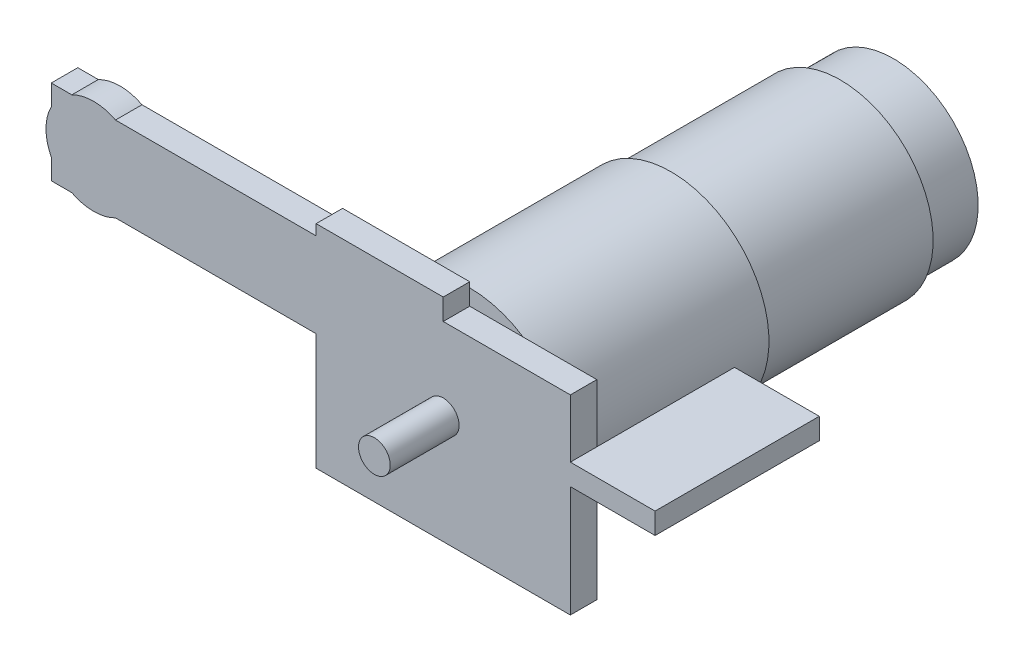
ISO-10303-21;
HEADER;
FILE_DESCRIPTION(('STEP AP214'),'2;1');
FILE_NAME('part.step','',(''),(''),'','','');
FILE_SCHEMA(('AUTOMOTIVE_DESIGN { 1 0 10303 214 1 1 1 1 }'));
ENDSEC;
DATA;
#1=APPLICATION_CONTEXT('core data for automotive mechanical design processes');
#2=APPLICATION_PROTOCOL_DEFINITION('international standard','automotive_design',2000,#1);
#3=PRODUCT_CONTEXT('',#1,'mechanical');
#4=PRODUCT('Part','Part','',(#3));
#5=PRODUCT_RELATED_PRODUCT_CATEGORY('part','',(#4));
#6=PRODUCT_DEFINITION_FORMATION('','',#4);
#7=PRODUCT_DEFINITION_CONTEXT('part definition',#1,'design');
#8=PRODUCT_DEFINITION('design','',#6,#7);
#9=PRODUCT_DEFINITION_SHAPE('','',#8);
#10=(LENGTH_UNIT() NAMED_UNIT(*) SI_UNIT(.MILLI.,.METRE.));
#11=(NAMED_UNIT(*) PLANE_ANGLE_UNIT() SI_UNIT($,.RADIAN.));
#12=(NAMED_UNIT(*) SI_UNIT($,.STERADIAN.) SOLID_ANGLE_UNIT());
#13=UNCERTAINTY_MEASURE_WITH_UNIT(LENGTH_MEASURE(1.E-05),#10,'distance_accuracy_value','');
#14=(GEOMETRIC_REPRESENTATION_CONTEXT(3) GLOBAL_UNCERTAINTY_ASSIGNED_CONTEXT((#13)) GLOBAL_UNIT_ASSIGNED_CONTEXT((#10,
#11,#12)) REPRESENTATION_CONTEXT('',''));
#15=CARTESIAN_POINT('',(0.,0.,0.));
#16=DIRECTION('',(0.,0.,1.));
#17=DIRECTION('',(1.,0.,0.));
#18=AXIS2_PLACEMENT_3D('',#15,#16,#17);
#19=CARTESIAN_POINT('',(41.5,36.,36.));
#20=DIRECTION('',(-1.,0.,0.));
#21=DIRECTION('',(0.,0.,1.));
#22=AXIS2_PLACEMENT_3D('',#19,#20,#21);
#23=PLANE('',#22);
#24=DIRECTION('',(0.,0.,1.));
#25=VECTOR('',#24,1.);
#26=CARTESIAN_POINT('',(41.5,25.,5.));
#27=LINE('',#26,#25);
#28=CARTESIAN_POINT('',(41.5,25.,31.));
#29=VERTEX_POINT('',#28);
#30=CARTESIAN_POINT('',(41.5,25.,36.));
#31=VERTEX_POINT('',#30);
#32=EDGE_CURVE('E55',#29,#31,#27,.T.);
#33=ORIENTED_EDGE('',*,*,#32,.F.);
#34=DIRECTION('',(0.,-1.,0.));
#35=VECTOR('',#34,1.);
#36=CARTESIAN_POINT('',(41.5,36.,31.));
#37=LINE('',#36,#35);
#38=CARTESIAN_POINT('',(41.5,36.,31.));
#39=VERTEX_POINT('',#38);
#40=EDGE_CURVE('E301',#39,#29,#37,.T.);
#41=ORIENTED_EDGE('',*,*,#40,.F.);
#42=DIRECTION('',(0.,0.,-1.));
#43=VECTOR('',#42,1.);
#44=CARTESIAN_POINT('',(41.5,36.,36.));
#45=LINE('',#44,#43);
#46=CARTESIAN_POINT('',(41.5,36.,36.));
#47=VERTEX_POINT('',#46);
#48=EDGE_CURVE('E198',#47,#39,#45,.T.);
#49=ORIENTED_EDGE('',*,*,#48,.F.);
#50=DIRECTION('',(0.,-1.,0.));
#51=VECTOR('',#50,1.);
#52=CARTESIAN_POINT('',(41.5,36.,36.));
#53=LINE('',#52,#51);
#54=EDGE_CURVE('E194',#47,#31,#53,.T.);
#55=ORIENTED_EDGE('',*,*,#54,.T.);
#56=EDGE_LOOP('',(#33,#41,#49,#55));
#57=FACE_BOUND('',#56,.T.);
#58=ADVANCED_FACE('F43',(#57),#23,.F.);
#59=CARTESIAN_POINT('',(-56.5,38.,31.));
#60=DIRECTION('',(1.,0.,0.));
#61=DIRECTION('',(0.,0.,-1.));
#62=AXIS2_PLACEMENT_3D('',#59,#60,#61);
#63=PLANE('',#62);
#64=DIRECTION('',(0.,0.,-1.));
#65=VECTOR('',#64,1.);
#66=CARTESIAN_POINT('',(-56.5,25.8768943743823,36.));
#67=LINE('',#66,#65);
#68=CARTESIAN_POINT('',(-56.5,25.8768943743823,31.));
#69=VERTEX_POINT('',#68);
#70=CARTESIAN_POINT('',(-56.5,25.8768943743823,36.));
#71=VERTEX_POINT('',#70);
#72=EDGE_CURVE('E254',#69,#71,#67,.F.);
#73=ORIENTED_EDGE('',*,*,#72,.F.);
#74=DIRECTION('',(0.,-1.,0.));
#75=VECTOR('',#74,1.);
#76=CARTESIAN_POINT('',(-56.5,38.,31.));
#77=LINE('',#76,#75);
#78=CARTESIAN_POINT('',(-56.5,22.,31.));
#79=VERTEX_POINT('',#78);
#80=EDGE_CURVE('E273',#69,#79,#77,.T.);
#81=ORIENTED_EDGE('',*,*,#80,.T.);
#82=DIRECTION('',(0.,0.,1.));
#83=VECTOR('',#82,1.);
#84=CARTESIAN_POINT('',(-56.5,22.,31.));
#85=LINE('',#84,#83);
#86=CARTESIAN_POINT('',(-56.5,22.,36.));
#87=VERTEX_POINT('',#86);
#88=EDGE_CURVE('E256',#79,#87,#85,.T.);
#89=ORIENTED_EDGE('',*,*,#88,.T.);
#90=DIRECTION('',(0.,-1.,0.));
#91=VECTOR('',#90,1.);
#92=CARTESIAN_POINT('',(-56.5,38.,36.));
#93=LINE('',#92,#91);
#94=EDGE_CURVE('E290',#71,#87,#93,.T.);
#95=ORIENTED_EDGE('',*,*,#94,.F.);
#96=EDGE_LOOP('',(#73,#81,#89,#95));
#97=FACE_BOUND('',#96,.T.);
#98=ADVANCED_FACE('F382',(#97),#63,.F.);
#99=DIRECTION('',(0.,0.,-1.));
#100=VECTOR('',#99,1.);
#101=CARTESIAN_POINT('',(-56.5,34.1231056256177,36.));
#102=LINE('',#101,#100);
#103=CARTESIAN_POINT('',(-56.5,34.1231056256177,36.));
#104=VERTEX_POINT('',#103);
#105=CARTESIAN_POINT('',(-56.5,34.1231056256177,31.));
#106=VERTEX_POINT('',#105);
#107=EDGE_CURVE('E252',#104,#106,#102,.T.);
#108=ORIENTED_EDGE('',*,*,#107,.F.);
#109=CARTESIAN_POINT('',(-56.5,38.,36.));
#110=VERTEX_POINT('',#109);
#111=EDGE_CURVE('E286',#110,#104,#93,.T.);
#112=ORIENTED_EDGE('',*,*,#111,.F.);
#113=DIRECTION('',(0.,0.,1.));
#114=VECTOR('',#113,1.);
#115=CARTESIAN_POINT('',(-56.5,38.,31.));
#116=LINE('',#115,#114);
#117=CARTESIAN_POINT('',(-56.5,38.,31.));
#118=VERTEX_POINT('',#117);
#119=EDGE_CURVE('E259',#118,#110,#116,.T.);
#120=ORIENTED_EDGE('',*,*,#119,.F.);
#121=EDGE_CURVE('E287',#118,#106,#77,.T.);
#122=ORIENTED_EDGE('',*,*,#121,.T.);
#123=EDGE_LOOP('',(#108,#112,#120,#122));
#124=FACE_BOUND('',#123,.T.);
#125=ADVANCED_FACE('F414',(#124),#63,.F.);
#126=CARTESIAN_POINT('',(0.,38.,0.));
#127=DIRECTION('',(0.,1.,0.));
#128=DIRECTION('',(0.,0.,1.));
#129=AXIS2_PLACEMENT_3D('',#126,#127,#128);
#130=PLANE('',#129);
#131=DIRECTION('',(-1.,0.,0.));
#132=VECTOR('',#131,1.);
#133=CARTESIAN_POINT('',(-6.5,38.,31.));
#134=LINE('',#133,#132);
#135=CARTESIAN_POINT('',(-6.5,38.,31.));
#136=VERTEX_POINT('',#135);
#137=CARTESIAN_POINT('',(-44.3768943743823,38.,31.));
#138=VERTEX_POINT('',#137);
#139=EDGE_CURVE('E271',#136,#138,#134,.T.);
#140=ORIENTED_EDGE('',*,*,#139,.T.);
#141=DIRECTION('',(0.,0.,-1.));
#142=VECTOR('',#141,1.);
#143=CARTESIAN_POINT('',(-44.3768943743823,38.,36.));
#144=LINE('',#143,#142);
#145=CARTESIAN_POINT('',(-44.3768943743823,38.,36.));
#146=VERTEX_POINT('',#145);
#147=EDGE_CURVE('E246',#138,#146,#144,.F.);
#148=ORIENTED_EDGE('',*,*,#147,.T.);
#149=DIRECTION('',(1.,0.,0.));
#150=VECTOR('',#149,1.);
#151=CARTESIAN_POINT('',(-56.5,38.,36.));
#152=LINE('',#151,#150);
#153=CARTESIAN_POINT('',(-6.5,38.,36.));
#154=VERTEX_POINT('',#153);
#155=EDGE_CURVE('E265',#146,#154,#152,.T.);
#156=ORIENTED_EDGE('',*,*,#155,.T.);
#157=DIRECTION('',(0.,0.,-1.));
#158=VECTOR('',#157,1.);
#159=CARTESIAN_POINT('',(-6.5,38.,36.));
#160=LINE('',#159,#158);
#161=EDGE_CURVE('E270',#154,#136,#160,.T.);
#162=ORIENTED_EDGE('',*,*,#161,.T.);
#163=EDGE_LOOP('',(#140,#148,#156,#162));
#164=FACE_BOUND('',#163,.T.);
#165=ADVANCED_FACE('F677',(#164),#130,.T.);
#166=CARTESIAN_POINT('',(-52.6231056256177,38.,36.));
#167=VERTEX_POINT('',#166);
#168=EDGE_CURVE('E262',#110,#167,#152,.T.);
#169=ORIENTED_EDGE('',*,*,#168,.T.);
#170=DIRECTION('',(0.,0.,-1.));
#171=VECTOR('',#170,1.);
#172=CARTESIAN_POINT('',(-52.6231056256177,38.,36.));
#173=LINE('',#172,#171);
#174=CARTESIAN_POINT('',(-52.6231056256177,38.,31.));
#175=VERTEX_POINT('',#174);
#176=EDGE_CURVE('E241',#167,#175,#173,.T.);
#177=ORIENTED_EDGE('',*,*,#176,.T.);
#178=EDGE_CURVE('E269',#175,#118,#134,.T.);
#179=ORIENTED_EDGE('',*,*,#178,.T.);
#180=ORIENTED_EDGE('',*,*,#119,.T.);
#181=EDGE_LOOP('',(#169,#177,#179,#180));
#182=FACE_BOUND('',#181,.T.);
#183=ADVANCED_FACE('F401',(#182),#130,.T.);
#184=CARTESIAN_POINT('',(0.,22.,0.));
#185=DIRECTION('',(0.,1.,0.));
#186=DIRECTION('',(0.,0.,1.));
#187=AXIS2_PLACEMENT_3D('',#184,#185,#186);
#188=PLANE('',#187);
#189=DIRECTION('',(0.,0.,-1.));
#190=VECTOR('',#189,1.);
#191=CARTESIAN_POINT('',(-44.3768943743823,22.,36.));
#192=LINE('',#191,#190);
#193=CARTESIAN_POINT('',(-44.3768943743823,22.,31.));
#194=VERTEX_POINT('',#193);
#195=CARTESIAN_POINT('',(-44.3768943743823,22.,36.));
#196=VERTEX_POINT('',#195);
#197=EDGE_CURVE('E50',#194,#196,#192,.F.);
#198=ORIENTED_EDGE('',*,*,#197,.F.);
#199=DIRECTION('',(-1.,0.,0.));
#200=VECTOR('',#199,1.);
#201=CARTESIAN_POINT('',(-6.5,22.,31.));
#202=LINE('',#201,#200);
#203=CARTESIAN_POINT('',(-6.5,22.,31.));
#204=VERTEX_POINT('',#203);
#205=EDGE_CURVE('E263',#204,#194,#202,.T.);
#206=ORIENTED_EDGE('',*,*,#205,.F.);
#207=DIRECTION('',(0.,0.,-1.));
#208=VECTOR('',#207,1.);
#209=CARTESIAN_POINT('',(-6.5,22.,36.));
#210=LINE('',#209,#208);
#211=CARTESIAN_POINT('',(-6.5,22.,36.));
#212=VERTEX_POINT('',#211);
#213=EDGE_CURVE('E281',#212,#204,#210,.T.);
#214=ORIENTED_EDGE('',*,*,#213,.F.);
#215=DIRECTION('',(1.,0.,0.));
#216=VECTOR('',#215,1.);
#217=CARTESIAN_POINT('',(-56.5,22.,36.));
#218=LINE('',#217,#216);
#219=EDGE_CURVE('E280',#196,#212,#218,.T.);
#220=ORIENTED_EDGE('',*,*,#219,.F.);
#221=EDGE_LOOP('',(#198,#206,#214,#220));
#222=FACE_BOUND('',#221,.T.);
#223=ADVANCED_FACE('F392',(#222),#188,.F.);
#224=DIRECTION('',(0.,0.,-1.));
#225=VECTOR('',#224,1.);
#226=CARTESIAN_POINT('',(-52.6231056256177,22.,36.));
#227=LINE('',#226,#225);
#228=CARTESIAN_POINT('',(-52.6231056256177,22.,36.));
#229=VERTEX_POINT('',#228);
#230=CARTESIAN_POINT('',(-52.6231056256177,22.,31.));
#231=VERTEX_POINT('',#230);
#232=EDGE_CURVE('E363',#229,#231,#227,.T.);
#233=ORIENTED_EDGE('',*,*,#232,.F.);
#234=EDGE_CURVE('E279',#87,#229,#218,.T.);
#235=ORIENTED_EDGE('',*,*,#234,.F.);
#236=ORIENTED_EDGE('',*,*,#88,.F.);
#237=EDGE_CURVE('E282',#231,#79,#202,.T.);
#238=ORIENTED_EDGE('',*,*,#237,.F.);
#239=EDGE_LOOP('',(#233,#235,#236,#238));
#240=FACE_BOUND('',#239,.T.);
#241=ADVANCED_FACE('F388',(#240),#188,.F.);
#242=CARTESIAN_POINT('',(-6.5,40.,31.));
#243=DIRECTION('',(1.,0.,0.));
#244=DIRECTION('',(0.,0.,-1.));
#245=AXIS2_PLACEMENT_3D('',#242,#243,#244);
#246=PLANE('',#245);
#247=ORIENTED_EDGE('',*,*,#161,.F.);
#248=DIRECTION('',(0.,-1.,0.));
#249=VECTOR('',#248,1.);
#250=CARTESIAN_POINT('',(-6.5,40.,36.));
#251=LINE('',#250,#249);
#252=CARTESIAN_POINT('',(-6.5,40.,36.));
#253=VERTEX_POINT('',#252);
#254=EDGE_CURVE('E331',#253,#154,#251,.T.);
#255=ORIENTED_EDGE('',*,*,#254,.F.);
#256=DIRECTION('',(0.,0.,1.));
#257=VECTOR('',#256,1.);
#258=CARTESIAN_POINT('',(-6.5,40.,31.));
#259=LINE('',#258,#257);
#260=CARTESIAN_POINT('',(-6.5,40.,31.));
#261=VERTEX_POINT('',#260);
#262=EDGE_CURVE('E307',#261,#253,#259,.T.);
#263=ORIENTED_EDGE('',*,*,#262,.F.);
#264=DIRECTION('',(0.,-1.,0.));
#265=VECTOR('',#264,1.);
#266=CARTESIAN_POINT('',(-6.5,40.,31.));
#267=LINE('',#266,#265);
#268=EDGE_CURVE('E324',#261,#136,#267,.T.);
#269=ORIENTED_EDGE('',*,*,#268,.T.);
#270=EDGE_LOOP('',(#247,#255,#263,#269));
#271=FACE_BOUND('',#270,.T.);
#272=ADVANCED_FACE('F395',(#271),#246,.F.);
#273=CARTESIAN_POINT('',(17.5,40.,36.));
#274=DIRECTION('',(-1.,0.,0.));
#275=DIRECTION('',(0.,0.,1.));
#276=AXIS2_PLACEMENT_3D('',#273,#274,#275);
#277=PLANE('',#276);
#278=DIRECTION('',(0.,0.,1.));
#279=VECTOR('',#278,1.);
#280=CARTESIAN_POINT('',(17.5,36.,31.));
#281=LINE('',#280,#279);
#282=CARTESIAN_POINT('',(17.5,36.,31.));
#283=VERTEX_POINT('',#282);
#284=CARTESIAN_POINT('',(17.5,36.,36.));
#285=VERTEX_POINT('',#284);
#286=EDGE_CURVE('E291',#283,#285,#281,.T.);
#287=ORIENTED_EDGE('',*,*,#286,.F.);
#288=DIRECTION('',(0.,-1.,0.));
#289=VECTOR('',#288,1.);
#290=CARTESIAN_POINT('',(17.5,40.,31.));
#291=LINE('',#290,#289);
#292=CARTESIAN_POINT('',(17.5,39.,31.));
#293=VERTEX_POINT('',#292);
#294=EDGE_CURVE('E330',#293,#283,#291,.T.);
#295=ORIENTED_EDGE('',*,*,#294,.F.);
#296=CARTESIAN_POINT('',(17.5,40.,31.));
#297=VERTEX_POINT('',#296);
#298=EDGE_CURVE('E327',#297,#293,#291,.T.);
#299=ORIENTED_EDGE('',*,*,#298,.F.);
#300=DIRECTION('',(0.,0.,-1.));
#301=VECTOR('',#300,1.);
#302=CARTESIAN_POINT('',(17.5,40.,36.));
#303=LINE('',#302,#301);
#304=CARTESIAN_POINT('',(17.5,40.,36.));
#305=VERTEX_POINT('',#304);
#306=EDGE_CURVE('E311',#305,#297,#303,.T.);
#307=ORIENTED_EDGE('',*,*,#306,.F.);
#308=DIRECTION('',(0.,-1.,0.));
#309=VECTOR('',#308,1.);
#310=CARTESIAN_POINT('',(17.5,40.,36.));
#311=LINE('',#310,#309);
#312=EDGE_CURVE('E332',#305,#285,#311,.T.);
#313=ORIENTED_EDGE('',*,*,#312,.T.);
#314=EDGE_LOOP('',(#287,#295,#299,#307,#313));
#315=FACE_BOUND('',#314,.T.);
#316=ADVANCED_FACE('F396',(#315),#277,.F.);
#317=CARTESIAN_POINT('',(17.5,20.5,-54.));
#318=DIRECTION('',(0.,0.,-1.));
#319=DIRECTION('',(-1.,0.,0.));
#320=AXIS2_PLACEMENT_3D('',#317,#318,#319);
#321=CYLINDRICAL_SURFACE('',#320,3.);
#322=CARTESIAN_POINT('',(17.5,20.5,49.));
#323=DIRECTION('',(0.,0.,-1.));
#324=DIRECTION('',(-1.,0.,0.));
#325=AXIS2_PLACEMENT_3D('',#322,#323,#324);
#326=CIRCLE('',#325,3.);
#327=CARTESIAN_POINT('',(14.5,20.5,49.));
#328=VERTEX_POINT('',#327);
#329=EDGE_CURVE('E357',#328,#328,#326,.T.);
#330=ORIENTED_EDGE('',*,*,#329,.T.);
#331=EDGE_LOOP('',(#330));
#332=FACE_BOUND('',#331,.T.);
#333=CARTESIAN_POINT('',(17.5,20.5,36.));
#334=DIRECTION('',(0.,0.,-1.));
#335=DIRECTION('',(-1.,0.,0.));
#336=AXIS2_PLACEMENT_3D('',#333,#334,#335);
#337=CIRCLE('',#336,3.);
#338=CARTESIAN_POINT('',(14.5,20.5,36.));
#339=VERTEX_POINT('',#338);
#340=EDGE_CURVE('E356',#339,#339,#337,.T.);
#341=ORIENTED_EDGE('',*,*,#340,.F.);
#342=EDGE_LOOP('',(#341));
#343=FACE_BOUND('',#342,.T.);
#344=ADVANCED_FACE('F440',(#332,#343),#321,.T.);
#345=CARTESIAN_POINT('',(20.5,20.5,31.));
#346=DIRECTION('',(0.,0.,-1.));
#347=DIRECTION('',(-1.,0.,0.));
#348=AXIS2_PLACEMENT_3D('',#345,#346,#347);
#349=PLANE('',#348);
#350=DIRECTION('',(-1.,0.,0.));
#351=VECTOR('',#350,1.);
#352=CARTESIAN_POINT('',(41.5,36.,31.));
#353=LINE('',#352,#351);
#354=CARTESIAN_POINT('',(27.5995049383621,36.,31.));
#355=VERTEX_POINT('',#354);
#356=EDGE_CURVE('E298',#355,#283,#353,.T.);
#357=ORIENTED_EDGE('',*,*,#356,.F.);
#358=CARTESIAN_POINT('',(17.5,20.5,31.));
#359=DIRECTION('',(0.,0.,-1.));
#360=DIRECTION('',(-1.,0.,0.));
#361=AXIS2_PLACEMENT_3D('',#358,#359,#360);
#362=CIRCLE('',#361,18.5);
#363=EDGE_CURVE('E352',#293,#355,#362,.T.);
#364=ORIENTED_EDGE('',*,*,#363,.F.);
#365=ORIENTED_EDGE('',*,*,#294,.T.);
#366=EDGE_LOOP('',(#357,#364,#365));
#367=FACE_BOUND('',#366,.T.);
#368=ADVANCED_FACE('F467',(#367),#349,.F.);
#369=CARTESIAN_POINT('',(17.5,20.5,49.));
#370=DIRECTION('',(0.,0.,-1.));
#371=DIRECTION('',(-1.,0.,0.));
#372=AXIS2_PLACEMENT_3D('',#369,#370,#371);
#373=PLANE('',#372);
#374=ORIENTED_EDGE('',*,*,#329,.F.);
#375=EDGE_LOOP('',(#374));
#376=FACE_BOUND('',#375,.T.);
#377=ADVANCED_FACE('F44',(#376),#373,.F.);
#378=CARTESIAN_POINT('',(17.5,20.5,-54.));
#379=DIRECTION('',(0.,0.,-1.));
#380=DIRECTION('',(-1.,0.,0.));
#381=AXIS2_PLACEMENT_3D('',#378,#379,#380);
#382=CYLINDRICAL_SURFACE('',#381,18.5);
#383=CARTESIAN_POINT('',(17.5,20.5,-7.));
#384=DIRECTION('',(0.,0.,-1.));
#385=DIRECTION('',(-1.,0.,0.));
#386=AXIS2_PLACEMENT_3D('',#383,#384,#385);
#387=CIRCLE('',#386,18.5);
#388=CARTESIAN_POINT('',(-0.999999999999994,20.5,-7.));
#389=VERTEX_POINT('',#388);
#390=EDGE_CURVE('E349',#389,#389,#387,.T.);
#391=ORIENTED_EDGE('',*,*,#390,.F.);
#392=EDGE_LOOP('',(#391));
#393=FACE_BOUND('',#392,.T.);
#394=ORIENTED_EDGE('',*,*,#363,.T.);
#395=EDGE_CURVE('E355',#355,#293,#362,.T.);
#396=ORIENTED_EDGE('',*,*,#395,.T.);
#397=EDGE_LOOP('',(#394,#396));
#398=FACE_BOUND('',#397,.T.);
#399=ADVANCED_FACE('F461',(#393,#398),#382,.T.);
#400=CARTESIAN_POINT('',(36.,20.5,-7.));
#401=DIRECTION('',(0.,0.,1.));
#402=DIRECTION('',(1.,0.,0.));
#403=AXIS2_PLACEMENT_3D('',#400,#401,#402);
#404=PLANE('',#403);
#405=CARTESIAN_POINT('',(17.5,20.5,-7.));
#406=DIRECTION('',(0.,0.,-1.));
#407=DIRECTION('',(-1.,0.,0.));
#408=AXIS2_PLACEMENT_3D('',#405,#406,#407);
#409=CIRCLE('',#408,17.5);
#410=CARTESIAN_POINT('',(0.,20.5,-7.));
#411=VERTEX_POINT('',#410);
#412=EDGE_CURVE('E347',#411,#411,#409,.T.);
#413=ORIENTED_EDGE('',*,*,#412,.F.);
#414=EDGE_LOOP('',(#413));
#415=FACE_BOUND('',#414,.T.);
#416=ORIENTED_EDGE('',*,*,#390,.T.);
#417=EDGE_LOOP('',(#416));
#418=FACE_BOUND('',#417,.T.);
#419=ADVANCED_FACE('F460',(#415,#418),#404,.F.);
#420=CARTESIAN_POINT('',(17.5,20.5,-54.));
#421=DIRECTION('',(0.,0.,-1.));
#422=DIRECTION('',(-1.,0.,0.));
#423=AXIS2_PLACEMENT_3D('',#420,#421,#422);
#424=CYLINDRICAL_SURFACE('',#423,17.5);
#425=CARTESIAN_POINT('',(17.5,20.5,-39.));
#426=DIRECTION('',(0.,0.,-1.));
#427=DIRECTION('',(-1.,0.,0.));
#428=AXIS2_PLACEMENT_3D('',#425,#426,#427);
#429=CIRCLE('',#428,17.5);
#430=CARTESIAN_POINT('',(0.,20.5,-39.));
#431=VERTEX_POINT('',#430);
#432=EDGE_CURVE('E345',#431,#431,#429,.T.);
#433=ORIENTED_EDGE('',*,*,#432,.F.);
#434=EDGE_LOOP('',(#433));
#435=FACE_BOUND('',#434,.T.);
#436=ORIENTED_EDGE('',*,*,#412,.T.);
#437=EDGE_LOOP('',(#436));
#438=FACE_BOUND('',#437,.T.);
#439=ADVANCED_FACE('F455',(#435,#438),#424,.T.);
#440=CARTESIAN_POINT('',(35.,20.5,-39.));
#441=DIRECTION('',(0.,0.,1.));
#442=DIRECTION('',(1.,0.,0.));
#443=AXIS2_PLACEMENT_3D('',#440,#441,#442);
#444=PLANE('',#443);
#445=CARTESIAN_POINT('',(17.5,20.5,-39.));
#446=DIRECTION('',(0.,0.,-1.));
#447=DIRECTION('',(-1.,0.,0.));
#448=AXIS2_PLACEMENT_3D('',#445,#446,#447);
#449=CIRCLE('',#448,16.);
#450=CARTESIAN_POINT('',(1.5,20.5,-39.));
#451=VERTEX_POINT('',#450);
#452=EDGE_CURVE('E339',#451,#451,#449,.T.);
#453=ORIENTED_EDGE('',*,*,#452,.F.);
#454=EDGE_LOOP('',(#453));
#455=FACE_BOUND('',#454,.T.);
#456=ORIENTED_EDGE('',*,*,#432,.T.);
#457=EDGE_LOOP('',(#456));
#458=FACE_BOUND('',#457,.T.);
#459=ADVANCED_FACE('F448',(#455,#458),#444,.F.);
#460=CARTESIAN_POINT('',(17.5,20.5,-54.));
#461=DIRECTION('',(0.,0.,-1.));
#462=DIRECTION('',(-1.,0.,0.));
#463=AXIS2_PLACEMENT_3D('',#460,#461,#462);
#464=CYLINDRICAL_SURFACE('',#463,16.);
#465=CARTESIAN_POINT('',(17.5,20.5,-49.));
#466=DIRECTION('',(0.,0.,-1.));
#467=DIRECTION('',(-1.,0.,0.));
#468=AXIS2_PLACEMENT_3D('',#465,#466,#467);
#469=CIRCLE('',#468,16.);
#470=CARTESIAN_POINT('',(1.5,20.5,-49.));
#471=VERTEX_POINT('',#470);
#472=EDGE_CURVE('E340',#471,#471,#469,.T.);
#473=ORIENTED_EDGE('',*,*,#472,.F.);
#474=EDGE_LOOP('',(#473));
#475=FACE_BOUND('',#474,.T.);
#476=ORIENTED_EDGE('',*,*,#452,.T.);
#477=EDGE_LOOP('',(#476));
#478=FACE_BOUND('',#477,.T.);
#479=ADVANCED_FACE('F443',(#475,#478),#464,.T.);
#480=CARTESIAN_POINT('',(33.5,20.5,-49.));
#481=DIRECTION('',(0.,0.,1.));
#482=DIRECTION('',(1.,0.,0.));
#483=AXIS2_PLACEMENT_3D('',#480,#481,#482);
#484=PLANE('',#483);
#485=ORIENTED_EDGE('',*,*,#472,.T.);
#486=EDGE_LOOP('',(#485));
#487=FACE_BOUND('',#486,.T.);
#488=ADVANCED_FACE('F432',(#487),#484,.F.);
#489=CARTESIAN_POINT('',(17.5,40.,31.));
#490=DIRECTION('',(0.,0.,1.));
#491=DIRECTION('',(1.,0.,0.));
#492=AXIS2_PLACEMENT_3D('',#489,#490,#491);
#493=PLANE('',#492);
#494=ORIENTED_EDGE('',*,*,#80,.F.);
#495=CARTESIAN_POINT('',(-48.5,30.,31.));
#496=DIRECTION('',(0.,0.,1.));
#497=DIRECTION('',(1.,0.,0.));
#498=AXIS2_PLACEMENT_3D('',#495,#496,#497);
#499=CIRCLE('',#498,9.);
#500=EDGE_CURVE('E247',#106,#69,#499,.T.);
#501=ORIENTED_EDGE('',*,*,#500,.F.);
#502=ORIENTED_EDGE('',*,*,#121,.F.);
#503=ORIENTED_EDGE('',*,*,#178,.F.);
#504=EDGE_CURVE('E243',#138,#175,#499,.T.);
#505=ORIENTED_EDGE('',*,*,#504,.F.);
#506=ORIENTED_EDGE('',*,*,#139,.F.);
#507=ORIENTED_EDGE('',*,*,#268,.F.);
#508=DIRECTION('',(-1.,0.,0.));
#509=VECTOR('',#508,1.);
#510=CARTESIAN_POINT('',(17.5,40.,31.));
#511=LINE('',#510,#509);
#512=EDGE_CURVE('E312',#297,#261,#511,.T.);
#513=ORIENTED_EDGE('',*,*,#512,.F.);
#514=ORIENTED_EDGE('',*,*,#298,.T.);
#515=ORIENTED_EDGE('',*,*,#395,.F.);
#516=EDGE_CURVE('E299',#39,#355,#353,.T.);
#517=ORIENTED_EDGE('',*,*,#516,.F.);
#518=ORIENTED_EDGE('',*,*,#40,.T.);
#519=CARTESIAN_POINT('',(41.5,21.,31.));
#520=VERTEX_POINT('',#519);
#521=EDGE_CURVE('E303',#29,#520,#37,.T.);
#522=ORIENTED_EDGE('',*,*,#521,.T.);
#523=CARTESIAN_POINT('',(41.5,0.,31.));
#524=VERTEX_POINT('',#523);
#525=EDGE_CURVE('E63',#520,#524,#37,.T.);
#526=ORIENTED_EDGE('',*,*,#525,.T.);
#527=DIRECTION('',(-1.,0.,0.));
#528=VECTOR('',#527,1.);
#529=CARTESIAN_POINT('',(17.5,0.,31.));
#530=LINE('',#529,#528);
#531=CARTESIAN_POINT('',(-6.5,0.,31.));
#532=VERTEX_POINT('',#531);
#533=EDGE_CURVE('E313',#524,#532,#530,.T.);
#534=ORIENTED_EDGE('',*,*,#533,.T.);
#535=EDGE_CURVE('E320',#204,#532,#267,.T.);
#536=ORIENTED_EDGE('',*,*,#535,.F.);
#537=ORIENTED_EDGE('',*,*,#205,.T.);
#538=EDGE_CURVE('E240',#231,#194,#499,.T.);
#539=ORIENTED_EDGE('',*,*,#538,.F.);
#540=ORIENTED_EDGE('',*,*,#237,.T.);
#541=EDGE_LOOP('',(#494,#501,#502,#503,#505,#506,#507,#513,#514,#515,#517,#518,#522,#526,#534,
#536,#537,#539,#540));
#542=FACE_BOUND('',#541,.T.);
#543=ADVANCED_FACE('F387',(#542),#493,.F.);
#544=CARTESIAN_POINT('',(-6.5,0.,36.));
#545=VERTEX_POINT('',#544);
#546=EDGE_CURVE('E334',#212,#545,#251,.T.);
#547=ORIENTED_EDGE('',*,*,#546,.F.);
#548=ORIENTED_EDGE('',*,*,#213,.T.);
#549=ORIENTED_EDGE('',*,*,#535,.T.);
#550=DIRECTION('',(0.,0.,1.));
#551=VECTOR('',#550,1.);
#552=CARTESIAN_POINT('',(-6.5,0.,31.));
#553=LINE('',#552,#551);
#554=EDGE_CURVE('E199',#532,#545,#553,.T.);
#555=ORIENTED_EDGE('',*,*,#554,.T.);
#556=EDGE_LOOP('',(#547,#548,#549,#555));
#557=FACE_BOUND('',#556,.T.);
#558=ADVANCED_FACE('F405',(#557),#246,.F.);
#559=CARTESIAN_POINT('',(-6.5,40.,36.));
#560=DIRECTION('',(0.,0.,-1.));
#561=DIRECTION('',(-1.,0.,0.));
#562=AXIS2_PLACEMENT_3D('',#559,#560,#561);
#563=PLANE('',#562);
#564=ORIENTED_EDGE('',*,*,#155,.F.);
#565=CARTESIAN_POINT('',(-48.5,30.,36.));
#566=DIRECTION('',(0.,0.,1.));
#567=DIRECTION('',(1.,0.,0.));
#568=AXIS2_PLACEMENT_3D('',#565,#566,#567);
#569=CIRCLE('',#568,9.);
#570=EDGE_CURVE('E236',#146,#167,#569,.T.);
#571=ORIENTED_EDGE('',*,*,#570,.T.);
#572=ORIENTED_EDGE('',*,*,#168,.F.);
#573=ORIENTED_EDGE('',*,*,#111,.T.);
#574=EDGE_CURVE('E245',#104,#71,#569,.T.);
#575=ORIENTED_EDGE('',*,*,#574,.T.);
#576=ORIENTED_EDGE('',*,*,#94,.T.);
#577=ORIENTED_EDGE('',*,*,#234,.T.);
#578=EDGE_CURVE('E242',#229,#196,#569,.T.);
#579=ORIENTED_EDGE('',*,*,#578,.T.);
#580=ORIENTED_EDGE('',*,*,#219,.T.);
#581=ORIENTED_EDGE('',*,*,#546,.T.);
#582=DIRECTION('',(1.,0.,0.));
#583=VECTOR('',#582,1.);
#584=CARTESIAN_POINT('',(-6.5,0.,36.));
#585=LINE('',#584,#583);
#586=CARTESIAN_POINT('',(41.5,0.,36.));
#587=VERTEX_POINT('',#586);
#588=EDGE_CURVE('E319',#545,#587,#585,.T.);
#589=ORIENTED_EDGE('',*,*,#588,.T.);
#590=CARTESIAN_POINT('',(41.5,21.,36.));
#591=VERTEX_POINT('',#590);
#592=EDGE_CURVE('E203',#591,#587,#53,.T.);
#593=ORIENTED_EDGE('',*,*,#592,.F.);
#594=DIRECTION('',(1.,0.,0.));
#595=VECTOR('',#594,1.);
#596=CARTESIAN_POINT('',(41.5,21.,36.));
#597=LINE('',#596,#595);
#598=CARTESIAN_POINT('',(57.5,21.,36.));
#599=VERTEX_POINT('',#598);
#600=EDGE_CURVE('E226',#591,#599,#597,.T.);
#601=ORIENTED_EDGE('',*,*,#600,.T.);
#602=DIRECTION('',(0.,-1.,0.));
#603=VECTOR('',#602,1.);
#604=CARTESIAN_POINT('',(57.5,25.,36.));
#605=LINE('',#604,#603);
#606=CARTESIAN_POINT('',(57.5,25.,36.));
#607=VERTEX_POINT('',#606);
#608=EDGE_CURVE('E214',#607,#599,#605,.T.);
#609=ORIENTED_EDGE('',*,*,#608,.F.);
#610=DIRECTION('',(1.,0.,0.));
#611=VECTOR('',#610,1.);
#612=CARTESIAN_POINT('',(41.5,25.,36.));
#613=LINE('',#612,#611);
#614=EDGE_CURVE('E206',#31,#607,#613,.T.);
#615=ORIENTED_EDGE('',*,*,#614,.F.);
#616=ORIENTED_EDGE('',*,*,#54,.F.);
#617=DIRECTION('',(1.,0.,0.));
#618=VECTOR('',#617,1.);
#619=CARTESIAN_POINT('',(17.5,36.,36.));
#620=LINE('',#619,#618);
#621=EDGE_CURVE('E296',#285,#47,#620,.T.);
#622=ORIENTED_EDGE('',*,*,#621,.F.);
#623=ORIENTED_EDGE('',*,*,#312,.F.);
#624=DIRECTION('',(1.,0.,0.));
#625=VECTOR('',#624,1.);
#626=CARTESIAN_POINT('',(-6.5,40.,36.));
#627=LINE('',#626,#625);
#628=EDGE_CURVE('E309',#253,#305,#627,.T.);
#629=ORIENTED_EDGE('',*,*,#628,.F.);
#630=ORIENTED_EDGE('',*,*,#254,.T.);
#631=EDGE_LOOP('',(#564,#571,#572,#573,#575,#576,#577,#579,#580,#581,#589,#593,#601,#609,#615,
#616,#622,#623,#629,#630));
#632=FACE_BOUND('',#631,.T.);
#633=ORIENTED_EDGE('',*,*,#340,.T.);
#634=EDGE_LOOP('',(#633));
#635=FACE_BOUND('',#634,.T.);
#636=ADVANCED_FACE('F215',(#632,#635),#563,.F.);
#637=CARTESIAN_POINT('',(0.,40.,0.));
#638=DIRECTION('',(0.,1.,0.));
#639=DIRECTION('',(0.,0.,1.));
#640=AXIS2_PLACEMENT_3D('',#637,#638,#639);
#641=PLANE('',#640);
#642=ORIENTED_EDGE('',*,*,#262,.T.);
#643=ORIENTED_EDGE('',*,*,#628,.T.);
#644=ORIENTED_EDGE('',*,*,#306,.T.);
#645=ORIENTED_EDGE('',*,*,#512,.T.);
#646=EDGE_LOOP('',(#642,#643,#644,#645));
#647=FACE_BOUND('',#646,.T.);
#648=ADVANCED_FACE('F421',(#647),#641,.T.);
#649=CARTESIAN_POINT('',(0.,0.,0.));
#650=DIRECTION('',(0.,1.,0.));
#651=DIRECTION('',(0.,0.,1.));
#652=AXIS2_PLACEMENT_3D('',#649,#650,#651);
#653=PLANE('',#652);
#654=ORIENTED_EDGE('',*,*,#554,.F.);
#655=ORIENTED_EDGE('',*,*,#533,.F.);
#656=DIRECTION('',(0.,0.,-1.));
#657=VECTOR('',#656,1.);
#658=CARTESIAN_POINT('',(41.5,0.,36.));
#659=LINE('',#658,#657);
#660=EDGE_CURVE('E295',#587,#524,#659,.T.);
#661=ORIENTED_EDGE('',*,*,#660,.F.);
#662=ORIENTED_EDGE('',*,*,#588,.F.);
#663=EDGE_LOOP('',(#654,#655,#661,#662));
#664=FACE_BOUND('',#663,.T.);
#665=ADVANCED_FACE('F417',(#664),#653,.F.);
#666=ORIENTED_EDGE('',*,*,#525,.F.);
#667=DIRECTION('',(0.,0.,1.));
#668=VECTOR('',#667,1.);
#669=CARTESIAN_POINT('',(41.5,21.,5.));
#670=LINE('',#669,#668);
#671=EDGE_CURVE('E11',#520,#591,#670,.T.);
#672=ORIENTED_EDGE('',*,*,#671,.T.);
#673=ORIENTED_EDGE('',*,*,#592,.T.);
#674=ORIENTED_EDGE('',*,*,#660,.T.);
#675=EDGE_LOOP('',(#666,#672,#673,#674));
#676=FACE_BOUND('',#675,.T.);
#677=ADVANCED_FACE('F407',(#676),#23,.F.);
#678=CARTESIAN_POINT('',(0.,36.,0.));
#679=DIRECTION('',(0.,1.,0.));
#680=DIRECTION('',(0.,0.,1.));
#681=AXIS2_PLACEMENT_3D('',#678,#679,#680);
#682=PLANE('',#681);
#683=ORIENTED_EDGE('',*,*,#286,.T.);
#684=ORIENTED_EDGE('',*,*,#621,.T.);
#685=ORIENTED_EDGE('',*,*,#48,.T.);
#686=ORIENTED_EDGE('',*,*,#516,.T.);
#687=ORIENTED_EDGE('',*,*,#356,.T.);
#688=EDGE_LOOP('',(#683,#684,#685,#686,#687));
#689=FACE_BOUND('',#688,.T.);
#690=ADVANCED_FACE('F418',(#689),#682,.T.);
#691=CARTESIAN_POINT('',(-48.5,30.,36.));
#692=DIRECTION('',(0.,0.,-1.));
#693=DIRECTION('',(-1.,0.,0.));
#694=AXIS2_PLACEMENT_3D('',#691,#692,#693);
#695=CYLINDRICAL_SURFACE('',#694,9.);
#696=ORIENTED_EDGE('',*,*,#538,.T.);
#697=ORIENTED_EDGE('',*,*,#197,.T.);
#698=ORIENTED_EDGE('',*,*,#578,.F.);
#699=ORIENTED_EDGE('',*,*,#232,.T.);
#700=EDGE_LOOP('',(#696,#697,#698,#699));
#701=FACE_BOUND('',#700,.T.);
#702=ADVANCED_FACE('F369',(#701),#695,.T.);
#703=ORIENTED_EDGE('',*,*,#147,.F.);
#704=ORIENTED_EDGE('',*,*,#504,.T.);
#705=ORIENTED_EDGE('',*,*,#176,.F.);
#706=ORIENTED_EDGE('',*,*,#570,.F.);
#707=EDGE_LOOP('',(#703,#704,#705,#706));
#708=FACE_BOUND('',#707,.T.);
#709=ADVANCED_FACE('F547',(#708),#695,.T.);
#710=ORIENTED_EDGE('',*,*,#500,.T.);
#711=ORIENTED_EDGE('',*,*,#72,.T.);
#712=ORIENTED_EDGE('',*,*,#574,.F.);
#713=ORIENTED_EDGE('',*,*,#107,.T.);
#714=EDGE_LOOP('',(#710,#711,#712,#713));
#715=FACE_BOUND('',#714,.T.);
#716=ADVANCED_FACE('F377',(#715),#695,.T.);
#717=CARTESIAN_POINT('',(41.5,25.,5.));
#718=DIRECTION('',(1.,0.,0.));
#719=DIRECTION('',(0.,0.,-1.));
#720=AXIS2_PLACEMENT_3D('',#717,#718,#719);
#721=PLANE('',#720);
#722=ORIENTED_EDGE('',*,*,#521,.F.);
#723=CARTESIAN_POINT('',(41.5,25.,5.));
#724=VERTEX_POINT('',#723);
#725=EDGE_CURVE('E207',#724,#29,#27,.T.);
#726=ORIENTED_EDGE('',*,*,#725,.F.);
#727=DIRECTION('',(0.,-1.,0.));
#728=VECTOR('',#727,1.);
#729=CARTESIAN_POINT('',(41.5,25.,5.));
#730=LINE('',#729,#728);
#731=CARTESIAN_POINT('',(41.5,21.,5.));
#732=VERTEX_POINT('',#731);
#733=EDGE_CURVE('E224',#724,#732,#730,.T.);
#734=ORIENTED_EDGE('',*,*,#733,.T.);
#735=EDGE_CURVE('E53',#732,#520,#670,.T.);
#736=ORIENTED_EDGE('',*,*,#735,.T.);
#737=EDGE_LOOP('',(#722,#726,#734,#736));
#738=FACE_BOUND('',#737,.T.);
#739=ADVANCED_FACE('F567',(#738),#721,.F.);
#740=CARTESIAN_POINT('',(57.5,25.,36.));
#741=DIRECTION('',(-1.,0.,0.));
#742=DIRECTION('',(0.,0.,1.));
#743=AXIS2_PLACEMENT_3D('',#740,#741,#742);
#744=PLANE('',#743);
#745=DIRECTION('',(0.,0.,-1.));
#746=VECTOR('',#745,1.);
#747=CARTESIAN_POINT('',(57.5,21.,36.));
#748=LINE('',#747,#746);
#749=CARTESIAN_POINT('',(57.5,21.,5.));
#750=VERTEX_POINT('',#749);
#751=EDGE_CURVE('E227',#599,#750,#748,.T.);
#752=ORIENTED_EDGE('',*,*,#751,.T.);
#753=DIRECTION('',(0.,-1.,0.));
#754=VECTOR('',#753,1.);
#755=CARTESIAN_POINT('',(57.5,25.,5.));
#756=LINE('',#755,#754);
#757=CARTESIAN_POINT('',(57.5,25.,5.));
#758=VERTEX_POINT('',#757);
#759=EDGE_CURVE('E235',#758,#750,#756,.T.);
#760=ORIENTED_EDGE('',*,*,#759,.F.);
#761=DIRECTION('',(0.,0.,-1.));
#762=VECTOR('',#761,1.);
#763=CARTESIAN_POINT('',(57.5,25.,36.));
#764=LINE('',#763,#762);
#765=EDGE_CURVE('E220',#607,#758,#764,.T.);
#766=ORIENTED_EDGE('',*,*,#765,.F.);
#767=ORIENTED_EDGE('',*,*,#608,.T.);
#768=EDGE_LOOP('',(#752,#760,#766,#767));
#769=FACE_BOUND('',#768,.T.);
#770=ADVANCED_FACE('F573',(#769),#744,.F.);
#771=CARTESIAN_POINT('',(57.5,25.,5.));
#772=DIRECTION('',(0.,0.,1.));
#773=DIRECTION('',(1.,0.,0.));
#774=AXIS2_PLACEMENT_3D('',#771,#772,#773);
#775=PLANE('',#774);
#776=DIRECTION('',(-1.,0.,0.));
#777=VECTOR('',#776,1.);
#778=CARTESIAN_POINT('',(57.5,21.,5.));
#779=LINE('',#778,#777);
#780=EDGE_CURVE('E222',#750,#732,#779,.T.);
#781=ORIENTED_EDGE('',*,*,#780,.T.);
#782=ORIENTED_EDGE('',*,*,#733,.F.);
#783=DIRECTION('',(-1.,0.,0.));
#784=VECTOR('',#783,1.);
#785=CARTESIAN_POINT('',(57.5,25.,5.));
#786=LINE('',#785,#784);
#787=EDGE_CURVE('E218',#758,#724,#786,.T.);
#788=ORIENTED_EDGE('',*,*,#787,.F.);
#789=ORIENTED_EDGE('',*,*,#759,.T.);
#790=EDGE_LOOP('',(#781,#782,#788,#789));
#791=FACE_BOUND('',#790,.T.);
#792=ADVANCED_FACE('F585',(#791),#775,.F.);
#793=CARTESIAN_POINT('',(0.,25.,0.));
#794=DIRECTION('',(0.,1.,0.));
#795=DIRECTION('',(0.,0.,1.));
#796=AXIS2_PLACEMENT_3D('',#793,#794,#795);
#797=PLANE('',#796);
#798=ORIENTED_EDGE('',*,*,#725,.T.);
#799=ORIENTED_EDGE('',*,*,#32,.T.);
#800=ORIENTED_EDGE('',*,*,#614,.T.);
#801=ORIENTED_EDGE('',*,*,#765,.T.);
#802=ORIENTED_EDGE('',*,*,#787,.T.);
#803=EDGE_LOOP('',(#798,#799,#800,#801,#802));
#804=FACE_BOUND('',#803,.T.);
#805=ADVANCED_FACE('F202',(#804),#797,.T.);
#806=CARTESIAN_POINT('',(0.,21.,0.));
#807=DIRECTION('',(0.,1.,0.));
#808=DIRECTION('',(0.,0.,1.));
#809=AXIS2_PLACEMENT_3D('',#806,#807,#808);
#810=PLANE('',#809);
#811=ORIENTED_EDGE('',*,*,#735,.F.);
#812=ORIENTED_EDGE('',*,*,#780,.F.);
#813=ORIENTED_EDGE('',*,*,#751,.F.);
#814=ORIENTED_EDGE('',*,*,#600,.F.);
#815=ORIENTED_EDGE('',*,*,#671,.F.);
#816=EDGE_LOOP('',(#811,#812,#813,#814,#815));
#817=FACE_BOUND('',#816,.T.);
#818=ADVANCED_FACE('F602',(#817),#810,.F.);
#819=CLOSED_SHELL('',(#58,#98,#125,#165,#183,#223,#241,#272,#316,#344,#368,#377,#399,#419,#439,
#459,#479,#488,#543,#558,#636,#648,#665,#677,#690,#702,#709,#716,#739,#770,#792,#805,#818));
#820=MANIFOLD_SOLID_BREP('B2',#819);
#821=ADVANCED_BREP_SHAPE_REPRESENTATION('',(#18,#820),#14);
#822=SHAPE_DEFINITION_REPRESENTATION(#9,#821);
ENDSEC;
END-ISO-10303-21;
